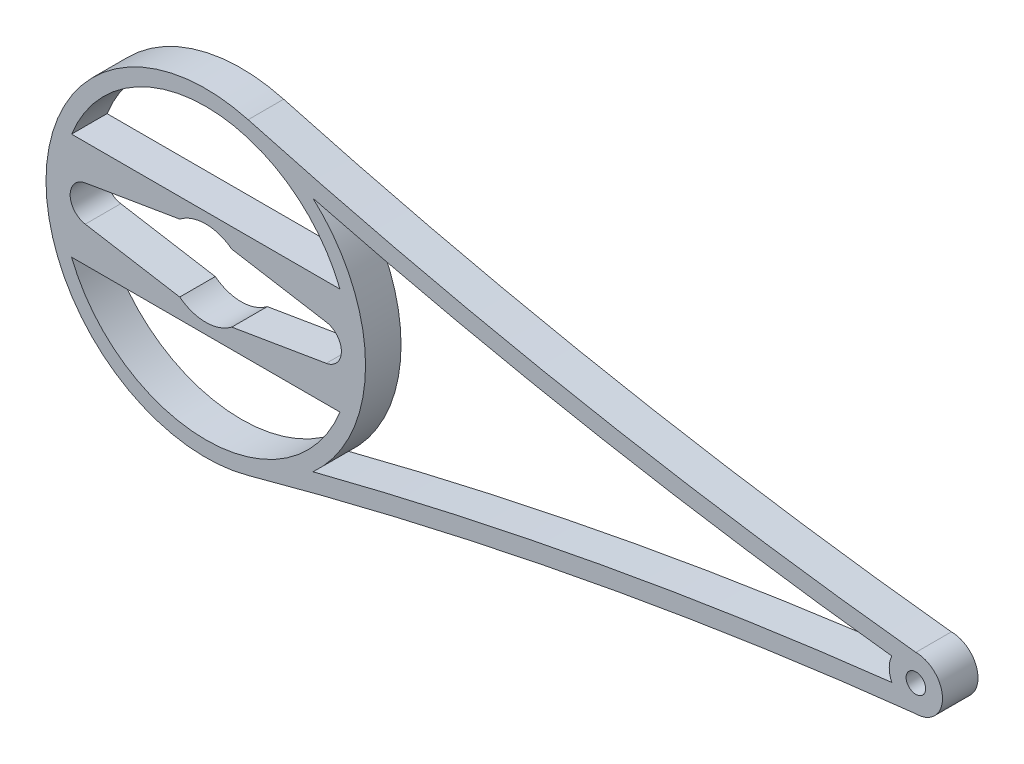
ISO-10303-21;
HEADER;
FILE_DESCRIPTION(('STEP AP214'),'2;1');
FILE_NAME('part.step','',(''),(''),'','','');
FILE_SCHEMA(('AUTOMOTIVE_DESIGN { 1 0 10303 214 1 1 1 1 }'));
ENDSEC;
DATA;
#1=APPLICATION_CONTEXT('core data for automotive mechanical design processes');
#2=APPLICATION_PROTOCOL_DEFINITION('international standard','automotive_design',2000,#1);
#3=PRODUCT_CONTEXT('',#1,'mechanical');
#4=PRODUCT('Part','Part','',(#3));
#5=PRODUCT_RELATED_PRODUCT_CATEGORY('part','',(#4));
#6=PRODUCT_DEFINITION_FORMATION('','',#4);
#7=PRODUCT_DEFINITION_CONTEXT('part definition',#1,'design');
#8=PRODUCT_DEFINITION('design','',#6,#7);
#9=PRODUCT_DEFINITION_SHAPE('','',#8);
#10=(LENGTH_UNIT() NAMED_UNIT(*) SI_UNIT(.MILLI.,.METRE.));
#11=(NAMED_UNIT(*) PLANE_ANGLE_UNIT() SI_UNIT($,.RADIAN.));
#12=(NAMED_UNIT(*) SI_UNIT($,.STERADIAN.) SOLID_ANGLE_UNIT());
#13=UNCERTAINTY_MEASURE_WITH_UNIT(LENGTH_MEASURE(1.E-05),#10,'distance_accuracy_value','');
#14=(GEOMETRIC_REPRESENTATION_CONTEXT(3) GLOBAL_UNCERTAINTY_ASSIGNED_CONTEXT((#13)) GLOBAL_UNIT_ASSIGNED_CONTEXT((#10,
#11,#12)) REPRESENTATION_CONTEXT('',''));
#15=CARTESIAN_POINT('',(0.,0.,0.));
#16=DIRECTION('',(0.,0.,1.));
#17=DIRECTION('',(1.,0.,0.));
#18=AXIS2_PLACEMENT_3D('',#15,#16,#17);
#19=CARTESIAN_POINT('',(132.546870891721,300.104276220759,2.5));
#20=DIRECTION('',(0.,0.,1.));
#21=DIRECTION('',(1.,0.,0.));
#22=AXIS2_PLACEMENT_3D('',#19,#20,#21);
#23=PLANE('',#22);
#24=CARTESIAN_POINT('',(100.,0.,2.5));
#25=DIRECTION('',(0.,0.,1.));
#26=DIRECTION('',(1.,0.,0.));
#27=AXIS2_PLACEMENT_3D('',#24,#25,#26);
#28=CIRCLE('',#27,1.375);
#29=CARTESIAN_POINT('',(101.375,0.,2.5));
#30=VERTEX_POINT('',#29);
#31=EDGE_CURVE('E557',#30,#30,#28,.T.);
#32=ORIENTED_EDGE('',*,*,#31,.F.);
#33=EDGE_LOOP('',(#32));
#34=FACE_BOUND('',#33,.T.);
#35=CARTESIAN_POINT('',(-16.55,0.,2.5));
#36=DIRECTION('',(0.,0.,1.));
#37=DIRECTION('',(1.,0.,0.));
#38=AXIS2_PLACEMENT_3D('',#35,#36,#37);
#39=CIRCLE('',#38,2.55);
#40=CARTESIAN_POINT('',(-16.9724253596674,2.51476774583854,2.5));
#41=VERTEX_POINT('',#40);
#42=CARTESIAN_POINT('',(-16.9724253596674,-2.51476774583853,2.5));
#43=VERTEX_POINT('',#42);
#44=EDGE_CURVE('E51',#41,#43,#39,.T.);
#45=ORIENTED_EDGE('',*,*,#44,.F.);
#46=DIRECTION('',(-0.986183429740603,-0.165657003791153,0.));
#47=VECTOR('',#46,1.);
#48=CARTESIAN_POINT('',(-16.9724253596674,2.51476774583854,2.5));
#49=LINE('',#48,#47);
#50=CARTESIAN_POINT('',(-3.6657195746538,4.75,2.5));
#51=VERTEX_POINT('',#50);
#52=EDGE_CURVE('E192',#51,#41,#49,.T.);
#53=ORIENTED_EDGE('',*,*,#52,.F.);
#54=CARTESIAN_POINT('',(0.,0.,2.5));
#55=DIRECTION('',(0.,0.,1.));
#56=DIRECTION('',(1.,0.,0.));
#57=AXIS2_PLACEMENT_3D('',#54,#55,#56);
#58=CIRCLE('',#57,6.);
#59=CARTESIAN_POINT('',(3.6657195746538,4.75,2.5));
#60=VERTEX_POINT('',#59);
#61=EDGE_CURVE('E195',#60,#51,#58,.T.);
#62=ORIENTED_EDGE('',*,*,#61,.F.);
#63=DIRECTION('',(-0.986183429740603,0.165657003791153,0.));
#64=VECTOR('',#63,1.);
#65=CARTESIAN_POINT('',(16.9724253596674,2.51476774583854,2.5));
#66=LINE('',#65,#64);
#67=CARTESIAN_POINT('',(16.9724253596674,2.51476774583854,2.5));
#68=VERTEX_POINT('',#67);
#69=EDGE_CURVE('E226',#68,#60,#66,.T.);
#70=ORIENTED_EDGE('',*,*,#69,.F.);
#71=CARTESIAN_POINT('',(16.55,0.,2.5));
#72=DIRECTION('',(0.,0.,1.));
#73=DIRECTION('',(-1.,0.,0.));
#74=AXIS2_PLACEMENT_3D('',#71,#72,#73);
#75=CIRCLE('',#74,2.55);
#76=CARTESIAN_POINT('',(16.9724253596674,-2.51476774583854,2.5));
#77=VERTEX_POINT('',#76);
#78=EDGE_CURVE('E223',#77,#68,#75,.T.);
#79=ORIENTED_EDGE('',*,*,#78,.F.);
#80=DIRECTION('',(0.986183429740603,0.165657003791153,0.));
#81=VECTOR('',#80,1.);
#82=CARTESIAN_POINT('',(16.9724253596674,-2.51476774583854,2.5));
#83=LINE('',#82,#81);
#84=CARTESIAN_POINT('',(3.66571957465379,-4.75,2.5));
#85=VERTEX_POINT('',#84);
#86=EDGE_CURVE('E220',#85,#77,#83,.T.);
#87=ORIENTED_EDGE('',*,*,#86,.F.);
#88=CARTESIAN_POINT('',(0.,0.,2.5));
#89=DIRECTION('',(0.,0.,1.));
#90=DIRECTION('',(1.,0.,0.));
#91=AXIS2_PLACEMENT_3D('',#88,#89,#90);
#92=CIRCLE('',#91,6.);
#93=CARTESIAN_POINT('',(-3.6657195746538,-4.75,2.5));
#94=VERTEX_POINT('',#93);
#95=EDGE_CURVE('E217',#94,#85,#92,.T.);
#96=ORIENTED_EDGE('',*,*,#95,.F.);
#97=DIRECTION('',(0.986183429740603,-0.165657003791154,0.));
#98=VECTOR('',#97,1.);
#99=CARTESIAN_POINT('',(-16.9724253596674,-2.51476774583854,2.5));
#100=LINE('',#99,#98);
#101=EDGE_CURVE('E215',#43,#94,#100,.T.);
#102=ORIENTED_EDGE('',*,*,#101,.F.);
#103=EDGE_LOOP('',(#45,#53,#62,#70,#79,#87,#96,#102));
#104=FACE_BOUND('',#103,.T.);
#105=CARTESIAN_POINT('',(165.093741783443,600.208552441517,2.5));
#106=DIRECTION('',(0.,0.,-1.));
#107=DIRECTION('',(1.,0.,0.));
#108=AXIS2_PLACEMENT_3D('',#105,#106,#107);
#109=CIRCLE('',#108,600.);
#110=CARTESIAN_POINT('',(100.,3.75,2.5));
#111=VERTEX_POINT('',#110);
#112=CARTESIAN_POINT('',(5.96724367891963,21.6942850280067,2.5));
#113=VERTEX_POINT('',#112);
#114=EDGE_CURVE('E310',#111,#113,#109,.T.);
#115=ORIENTED_EDGE('',*,*,#114,.T.);
#116=CARTESIAN_POINT('',(0.,0.,2.5));
#117=DIRECTION('',(0.,0.,1.));
#118=DIRECTION('',(1.,0.,0.));
#119=AXIS2_PLACEMENT_3D('',#116,#117,#118);
#120=CIRCLE('',#119,22.5);
#121=CARTESIAN_POINT('',(5.96724367891963,-21.6942850280067,2.5));
#122=VERTEX_POINT('',#121);
#123=EDGE_CURVE('E313',#113,#122,#120,.T.);
#124=ORIENTED_EDGE('',*,*,#123,.T.);
#125=CARTESIAN_POINT('',(165.093741783443,-600.208552441517,2.5));
#126=DIRECTION('',(0.,0.,-1.));
#127=DIRECTION('',(-1.,0.,0.));
#128=AXIS2_PLACEMENT_3D('',#125,#126,#127);
#129=CIRCLE('',#128,600.);
#130=CARTESIAN_POINT('',(100.,-3.75000000000014,2.5));
#131=VERTEX_POINT('',#130);
#132=EDGE_CURVE('E316',#122,#131,#129,.T.);
#133=ORIENTED_EDGE('',*,*,#132,.T.);
#134=CARTESIAN_POINT('',(100.,0.,2.5));
#135=DIRECTION('',(0.,0.,1.));
#136=DIRECTION('',(1.,0.,0.));
#137=AXIS2_PLACEMENT_3D('',#134,#135,#136);
#138=CIRCLE('',#137,3.75);
#139=EDGE_CURVE('E318',#131,#111,#138,.T.);
#140=ORIENTED_EDGE('',*,*,#139,.T.);
#141=EDGE_LOOP('',(#115,#124,#133,#140));
#142=FACE_BOUND('',#141,.T.);
#143=CARTESIAN_POINT('',(165.093741783443,600.208552441517,2.5));
#144=DIRECTION('',(0.,0.,-1.));
#145=DIRECTION('',(1.,0.,0.));
#146=AXIS2_PLACEMENT_3D('',#143,#144,#145);
#147=CIRCLE('',#146,602.5);
#148=CARTESIAN_POINT('',(96.6145446335033,1.61282111886629,2.5));
#149=VERTEX_POINT('',#148);
#150=CARTESIAN_POINT('',(15.1041910383297,16.6767326859201,2.5));
#151=VERTEX_POINT('',#150);
#152=EDGE_CURVE('E281',#149,#151,#147,.T.);
#153=ORIENTED_EDGE('',*,*,#152,.F.);
#154=CARTESIAN_POINT('',(100.,0.,2.5));
#155=DIRECTION('',(0.,0.,-1.));
#156=DIRECTION('',(1.,0.,0.));
#157=AXIS2_PLACEMENT_3D('',#154,#155,#156);
#158=CIRCLE('',#157,3.75000000000003);
#159=CARTESIAN_POINT('',(96.6145446335037,-1.61282111886629,2.5));
#160=VERTEX_POINT('',#159);
#161=EDGE_CURVE('E279',#160,#149,#158,.T.);
#162=ORIENTED_EDGE('',*,*,#161,.F.);
#163=CARTESIAN_POINT('',(165.093741783443,-600.208552441517,2.5));
#164=DIRECTION('',(0.,0.,-1.));
#165=DIRECTION('',(-1.,0.,0.));
#166=AXIS2_PLACEMENT_3D('',#163,#164,#165);
#167=CIRCLE('',#166,602.5);
#168=CARTESIAN_POINT('',(15.1041910383297,-16.6767326859201,2.5));
#169=VERTEX_POINT('',#168);
#170=EDGE_CURVE('E287',#169,#160,#167,.T.);
#171=ORIENTED_EDGE('',*,*,#170,.F.);
#172=CARTESIAN_POINT('',(0.,0.,2.5));
#173=DIRECTION('',(0.,0.,-1.));
#174=DIRECTION('',(1.,0.,0.));
#175=AXIS2_PLACEMENT_3D('',#172,#173,#174);
#176=CIRCLE('',#175,22.4999999999999);
#177=EDGE_CURVE('E284',#151,#169,#176,.T.);
#178=ORIENTED_EDGE('',*,*,#177,.F.);
#179=EDGE_LOOP('',(#153,#162,#171,#178));
#180=FACE_BOUND('',#179,.T.);
#181=DIRECTION('',(1.,0.,0.));
#182=VECTOR('',#181,1.);
#183=CARTESIAN_POINT('',(-18.9,7.5,2.5));
#184=LINE('',#183,#182);
#185=CARTESIAN_POINT('',(-18.9,7.50000000000001,2.5));
#186=VERTEX_POINT('',#185);
#187=CARTESIAN_POINT('',(18.9,7.5,2.5));
#188=VERTEX_POINT('',#187);
#189=EDGE_CURVE('E265',#186,#188,#184,.T.);
#190=ORIENTED_EDGE('',*,*,#189,.F.);
#191=CARTESIAN_POINT('',(0.,0.,2.5));
#192=DIRECTION('',(0.,0.,1.));
#193=DIRECTION('',(1.,0.,0.));
#194=AXIS2_PLACEMENT_3D('',#191,#192,#193);
#195=CIRCLE('',#194,20.3337158433967);
#196=EDGE_CURVE('E262',#188,#186,#195,.T.);
#197=ORIENTED_EDGE('',*,*,#196,.F.);
#198=EDGE_LOOP('',(#190,#197));
#199=FACE_BOUND('',#198,.T.);
#200=DIRECTION('',(-1.,0.,0.));
#201=VECTOR('',#200,1.);
#202=CARTESIAN_POINT('',(-18.9,-7.5,2.5));
#203=LINE('',#202,#201);
#204=CARTESIAN_POINT('',(18.9,-7.50000000000001,2.5));
#205=VERTEX_POINT('',#204);
#206=CARTESIAN_POINT('',(-18.9,-7.5,2.5));
#207=VERTEX_POINT('',#206);
#208=EDGE_CURVE('E248',#205,#207,#203,.T.);
#209=ORIENTED_EDGE('',*,*,#208,.F.);
#210=CARTESIAN_POINT('',(0.,0.,2.5));
#211=DIRECTION('',(0.,0.,1.));
#212=DIRECTION('',(1.,0.,0.));
#213=AXIS2_PLACEMENT_3D('',#210,#211,#212);
#214=CIRCLE('',#213,20.3337158433967);
#215=EDGE_CURVE('E245',#207,#205,#214,.T.);
#216=ORIENTED_EDGE('',*,*,#215,.F.);
#217=EDGE_LOOP('',(#209,#216));
#218=FACE_BOUND('',#217,.T.);
#219=ADVANCED_FACE('F36',(#34,#104,#142,#180,#199,#218),#23,.T.);
#220=CARTESIAN_POINT('',(132.546870891721,300.104276220759,-2.5));
#221=DIRECTION('',(0.,0.,1.));
#222=DIRECTION('',(1.,0.,0.));
#223=AXIS2_PLACEMENT_3D('',#220,#221,#222);
#224=PLANE('',#223);
#225=CARTESIAN_POINT('',(100.,0.,-2.5));
#226=DIRECTION('',(0.,0.,1.));
#227=DIRECTION('',(1.,0.,0.));
#228=AXIS2_PLACEMENT_3D('',#225,#226,#227);
#229=CIRCLE('',#228,1.375);
#230=CARTESIAN_POINT('',(101.375,0.,-2.5));
#231=VERTEX_POINT('',#230);
#232=EDGE_CURVE('E198',#231,#231,#229,.T.);
#233=ORIENTED_EDGE('',*,*,#232,.T.);
#234=EDGE_LOOP('',(#233));
#235=FACE_BOUND('',#234,.T.);
#236=DIRECTION('',(-0.986183429740603,-0.165657003791153,0.));
#237=VECTOR('',#236,1.);
#238=CARTESIAN_POINT('',(-16.9724253596674,2.51476774583854,-2.5));
#239=LINE('',#238,#237);
#240=CARTESIAN_POINT('',(-3.6657195746538,4.75,-2.5));
#241=VERTEX_POINT('',#240);
#242=CARTESIAN_POINT('',(-16.9724253596674,2.51476774583854,-2.5));
#243=VERTEX_POINT('',#242);
#244=EDGE_CURVE('E181',#241,#243,#239,.T.);
#245=ORIENTED_EDGE('',*,*,#244,.T.);
#246=CARTESIAN_POINT('',(-16.55,0.,-2.5));
#247=DIRECTION('',(0.,0.,1.));
#248=DIRECTION('',(1.,0.,0.));
#249=AXIS2_PLACEMENT_3D('',#246,#247,#248);
#250=CIRCLE('',#249,2.55);
#251=CARTESIAN_POINT('',(-16.9724253596674,-2.51476774583854,-2.5));
#252=VERTEX_POINT('',#251);
#253=EDGE_CURVE('E175',#243,#252,#250,.T.);
#254=ORIENTED_EDGE('',*,*,#253,.T.);
#255=DIRECTION('',(0.986183429740603,-0.165657003791154,0.));
#256=VECTOR('',#255,1.);
#257=CARTESIAN_POINT('',(-16.9724253596674,-2.51476774583854,-2.5));
#258=LINE('',#257,#256);
#259=CARTESIAN_POINT('',(-3.66571957465378,-4.75,-2.5));
#260=VERTEX_POINT('',#259);
#261=EDGE_CURVE('E184',#252,#260,#258,.T.);
#262=ORIENTED_EDGE('',*,*,#261,.T.);
#263=CARTESIAN_POINT('',(0.,0.,-2.5));
#264=DIRECTION('',(0.,0.,1.));
#265=DIRECTION('',(1.,0.,0.));
#266=AXIS2_PLACEMENT_3D('',#263,#264,#265);
#267=CIRCLE('',#266,6.);
#268=CARTESIAN_POINT('',(3.66571957465379,-4.75,-2.5));
#269=VERTEX_POINT('',#268);
#270=EDGE_CURVE('E59',#260,#269,#267,.T.);
#271=ORIENTED_EDGE('',*,*,#270,.T.);
#272=DIRECTION('',(0.986183429740603,0.165657003791153,0.));
#273=VECTOR('',#272,1.);
#274=CARTESIAN_POINT('',(16.9724253596674,-2.51476774583854,-2.5));
#275=LINE('',#274,#273);
#276=CARTESIAN_POINT('',(16.9724253596674,-2.51476774583854,-2.5));
#277=VERTEX_POINT('',#276);
#278=EDGE_CURVE('E202',#269,#277,#275,.T.);
#279=ORIENTED_EDGE('',*,*,#278,.T.);
#280=CARTESIAN_POINT('',(16.55,0.,-2.5));
#281=DIRECTION('',(0.,0.,1.));
#282=DIRECTION('',(-1.,0.,0.));
#283=AXIS2_PLACEMENT_3D('',#280,#281,#282);
#284=CIRCLE('',#283,2.55);
#285=CARTESIAN_POINT('',(16.9724253596674,2.51476774583854,-2.5));
#286=VERTEX_POINT('',#285);
#287=EDGE_CURVE('E205',#277,#286,#284,.T.);
#288=ORIENTED_EDGE('',*,*,#287,.T.);
#289=DIRECTION('',(-0.986183429740603,0.165657003791153,0.));
#290=VECTOR('',#289,1.);
#291=CARTESIAN_POINT('',(16.9724253596674,2.51476774583854,-2.5));
#292=LINE('',#291,#290);
#293=CARTESIAN_POINT('',(3.6657195746538,4.75,-2.5));
#294=VERTEX_POINT('',#293);
#295=EDGE_CURVE('E208',#286,#294,#292,.T.);
#296=ORIENTED_EDGE('',*,*,#295,.T.);
#297=CARTESIAN_POINT('',(0.,0.,-2.5));
#298=DIRECTION('',(0.,0.,1.));
#299=DIRECTION('',(1.,0.,0.));
#300=AXIS2_PLACEMENT_3D('',#297,#298,#299);
#301=CIRCLE('',#300,6.);
#302=EDGE_CURVE('E211',#294,#241,#301,.T.);
#303=ORIENTED_EDGE('',*,*,#302,.T.);
#304=EDGE_LOOP('',(#245,#254,#262,#271,#279,#288,#296,#303));
#305=FACE_BOUND('',#304,.T.);
#306=CARTESIAN_POINT('',(0.,0.,-2.5));
#307=DIRECTION('',(0.,0.,1.));
#308=DIRECTION('',(1.,0.,0.));
#309=AXIS2_PLACEMENT_3D('',#306,#307,#308);
#310=CIRCLE('',#309,20.3337158433967);
#311=CARTESIAN_POINT('',(18.9,7.50000000000001,-2.5));
#312=VERTEX_POINT('',#311);
#313=CARTESIAN_POINT('',(-18.9,7.5,-2.5));
#314=VERTEX_POINT('',#313);
#315=EDGE_CURVE('E261',#312,#314,#310,.T.);
#316=ORIENTED_EDGE('',*,*,#315,.T.);
#317=DIRECTION('',(1.,0.,0.));
#318=VECTOR('',#317,1.);
#319=CARTESIAN_POINT('',(-18.9,7.5,-2.5));
#320=LINE('',#319,#318);
#321=EDGE_CURVE('E266',#314,#312,#320,.T.);
#322=ORIENTED_EDGE('',*,*,#321,.T.);
#323=EDGE_LOOP('',(#316,#322));
#324=FACE_BOUND('',#323,.T.);
#325=CARTESIAN_POINT('',(165.093741783443,600.208552441517,-2.5));
#326=DIRECTION('',(0.,0.,-1.));
#327=DIRECTION('',(1.,0.,0.));
#328=AXIS2_PLACEMENT_3D('',#325,#326,#327);
#329=CIRCLE('',#328,600.);
#330=CARTESIAN_POINT('',(100.,3.75,-2.5));
#331=VERTEX_POINT('',#330);
#332=CARTESIAN_POINT('',(5.96724367891963,21.6942850280067,-2.5));
#333=VERTEX_POINT('',#332);
#334=EDGE_CURVE('E309',#331,#333,#329,.T.);
#335=ORIENTED_EDGE('',*,*,#334,.F.);
#336=CARTESIAN_POINT('',(100.,0.,-2.5));
#337=DIRECTION('',(0.,0.,1.));
#338=DIRECTION('',(1.,0.,0.));
#339=AXIS2_PLACEMENT_3D('',#336,#337,#338);
#340=CIRCLE('',#339,3.75);
#341=CARTESIAN_POINT('',(100.,-3.75000000000014,-2.5));
#342=VERTEX_POINT('',#341);
#343=EDGE_CURVE('E314',#342,#331,#340,.T.);
#344=ORIENTED_EDGE('',*,*,#343,.F.);
#345=CARTESIAN_POINT('',(165.093741783443,-600.208552441517,-2.5));
#346=DIRECTION('',(0.,0.,-1.));
#347=DIRECTION('',(-1.,0.,0.));
#348=AXIS2_PLACEMENT_3D('',#345,#346,#347);
#349=CIRCLE('',#348,600.);
#350=CARTESIAN_POINT('',(5.96724367891963,-21.6942850280067,-2.5));
#351=VERTEX_POINT('',#350);
#352=EDGE_CURVE('E325',#351,#342,#349,.T.);
#353=ORIENTED_EDGE('',*,*,#352,.F.);
#354=CARTESIAN_POINT('',(0.,0.,-2.5));
#355=DIRECTION('',(0.,0.,1.));
#356=DIRECTION('',(1.,0.,0.));
#357=AXIS2_PLACEMENT_3D('',#354,#355,#356);
#358=CIRCLE('',#357,22.5);
#359=EDGE_CURVE('E323',#333,#351,#358,.T.);
#360=ORIENTED_EDGE('',*,*,#359,.F.);
#361=EDGE_LOOP('',(#335,#344,#353,#360));
#362=FACE_BOUND('',#361,.T.);
#363=CARTESIAN_POINT('',(100.,0.,-2.5));
#364=DIRECTION('',(0.,0.,-1.));
#365=DIRECTION('',(1.,0.,0.));
#366=AXIS2_PLACEMENT_3D('',#363,#364,#365);
#367=CIRCLE('',#366,3.75000000000003);
#368=CARTESIAN_POINT('',(96.6145446335037,-1.61282111886629,-2.5));
#369=VERTEX_POINT('',#368);
#370=CARTESIAN_POINT('',(96.6145446335033,1.61282111886629,-2.5));
#371=VERTEX_POINT('',#370);
#372=EDGE_CURVE('E278',#369,#371,#367,.T.);
#373=ORIENTED_EDGE('',*,*,#372,.T.);
#374=CARTESIAN_POINT('',(165.093741783443,600.208552441517,-2.5));
#375=DIRECTION('',(0.,0.,-1.));
#376=DIRECTION('',(1.,0.,0.));
#377=AXIS2_PLACEMENT_3D('',#374,#375,#376);
#378=CIRCLE('',#377,602.5);
#379=CARTESIAN_POINT('',(15.1041910383297,16.6767326859201,-2.5));
#380=VERTEX_POINT('',#379);
#381=EDGE_CURVE('E292',#371,#380,#378,.T.);
#382=ORIENTED_EDGE('',*,*,#381,.T.);
#383=CARTESIAN_POINT('',(0.,0.,-2.5));
#384=DIRECTION('',(0.,0.,-1.));
#385=DIRECTION('',(1.,0.,0.));
#386=AXIS2_PLACEMENT_3D('',#383,#384,#385);
#387=CIRCLE('',#386,22.4999999999999);
#388=CARTESIAN_POINT('',(15.1041910383298,-16.6767326859201,-2.5));
#389=VERTEX_POINT('',#388);
#390=EDGE_CURVE('E295',#380,#389,#387,.T.);
#391=ORIENTED_EDGE('',*,*,#390,.T.);
#392=CARTESIAN_POINT('',(165.093741783443,-600.208552441517,-2.5));
#393=DIRECTION('',(0.,0.,-1.));
#394=DIRECTION('',(-1.,0.,0.));
#395=AXIS2_PLACEMENT_3D('',#392,#393,#394);
#396=CIRCLE('',#395,602.5);
#397=EDGE_CURVE('E282',#389,#369,#396,.T.);
#398=ORIENTED_EDGE('',*,*,#397,.T.);
#399=EDGE_LOOP('',(#373,#382,#391,#398));
#400=FACE_BOUND('',#399,.T.);
#401=CARTESIAN_POINT('',(0.,0.,-2.5));
#402=DIRECTION('',(0.,0.,1.));
#403=DIRECTION('',(1.,0.,0.));
#404=AXIS2_PLACEMENT_3D('',#401,#402,#403);
#405=CIRCLE('',#404,20.3337158433967);
#406=CARTESIAN_POINT('',(-18.9,-7.50000000000001,-2.5));
#407=VERTEX_POINT('',#406);
#408=CARTESIAN_POINT('',(18.9,-7.5,-2.5));
#409=VERTEX_POINT('',#408);
#410=EDGE_CURVE('E233',#407,#409,#405,.T.);
#411=ORIENTED_EDGE('',*,*,#410,.T.);
#412=DIRECTION('',(-1.,0.,0.));
#413=VECTOR('',#412,1.);
#414=CARTESIAN_POINT('',(-18.9,-7.5,-2.5));
#415=LINE('',#414,#413);
#416=EDGE_CURVE('E249',#409,#407,#415,.T.);
#417=ORIENTED_EDGE('',*,*,#416,.T.);
#418=EDGE_LOOP('',(#411,#417));
#419=FACE_BOUND('',#418,.T.);
#420=ADVANCED_FACE('F188',(#235,#305,#324,#362,#400,#419),#224,.F.);
#421=CARTESIAN_POINT('',(165.093741783443,600.208552441517,2.5));
#422=DIRECTION('',(0.,0.,-1.));
#423=DIRECTION('',(-1.,0.,0.));
#424=AXIS2_PLACEMENT_3D('',#421,#422,#423);
#425=CYLINDRICAL_SURFACE('',#424,600.);
#426=ORIENTED_EDGE('',*,*,#334,.T.);
#427=DIRECTION('',(0.,0.,-1.));
#428=VECTOR('',#427,1.);
#429=CARTESIAN_POINT('',(5.96724367891963,21.6942850280067,2.5));
#430=LINE('',#429,#428);
#431=EDGE_CURVE('E11',#113,#333,#430,.T.);
#432=ORIENTED_EDGE('',*,*,#431,.F.);
#433=ORIENTED_EDGE('',*,*,#114,.F.);
#434=DIRECTION('',(0.,0.,-1.));
#435=VECTOR('',#434,1.);
#436=CARTESIAN_POINT('',(100.,3.75,2.5));
#437=LINE('',#436,#435);
#438=EDGE_CURVE('E320',#111,#331,#437,.T.);
#439=ORIENTED_EDGE('',*,*,#438,.T.);
#440=EDGE_LOOP('',(#426,#432,#433,#439));
#441=FACE_BOUND('',#440,.T.);
#442=ADVANCED_FACE('F38',(#441),#425,.F.);
#443=CARTESIAN_POINT('',(0.,0.,2.5));
#444=DIRECTION('',(0.,0.,-1.));
#445=DIRECTION('',(-1.,0.,0.));
#446=AXIS2_PLACEMENT_3D('',#443,#444,#445);
#447=CYLINDRICAL_SURFACE('',#446,22.5);
#448=ORIENTED_EDGE('',*,*,#359,.T.);
#449=DIRECTION('',(0.,0.,-1.));
#450=VECTOR('',#449,1.);
#451=CARTESIAN_POINT('',(5.96724367891963,-21.6942850280067,2.5));
#452=LINE('',#451,#450);
#453=EDGE_CURVE('E44',#122,#351,#452,.T.);
#454=ORIENTED_EDGE('',*,*,#453,.F.);
#455=ORIENTED_EDGE('',*,*,#123,.F.);
#456=ORIENTED_EDGE('',*,*,#431,.T.);
#457=EDGE_LOOP('',(#448,#454,#455,#456));
#458=FACE_BOUND('',#457,.T.);
#459=ADVANCED_FACE('F353',(#458),#447,.T.);
#460=CARTESIAN_POINT('',(165.093741783443,-600.208552441517,2.5));
#461=DIRECTION('',(0.,0.,-1.));
#462=DIRECTION('',(-1.,0.,0.));
#463=AXIS2_PLACEMENT_3D('',#460,#461,#462);
#464=CYLINDRICAL_SURFACE('',#463,600.);
#465=ORIENTED_EDGE('',*,*,#352,.T.);
#466=DIRECTION('',(0.,0.,-1.));
#467=VECTOR('',#466,1.);
#468=CARTESIAN_POINT('',(100.,-3.75000000000014,2.5));
#469=LINE('',#468,#467);
#470=EDGE_CURVE('E330',#131,#342,#469,.T.);
#471=ORIENTED_EDGE('',*,*,#470,.F.);
#472=ORIENTED_EDGE('',*,*,#132,.F.);
#473=ORIENTED_EDGE('',*,*,#453,.T.);
#474=EDGE_LOOP('',(#465,#471,#472,#473));
#475=FACE_BOUND('',#474,.T.);
#476=ADVANCED_FACE('F337',(#475),#464,.F.);
#477=CARTESIAN_POINT('',(100.,0.,2.5));
#478=DIRECTION('',(0.,0.,-1.));
#479=DIRECTION('',(-1.,0.,0.));
#480=AXIS2_PLACEMENT_3D('',#477,#478,#479);
#481=CYLINDRICAL_SURFACE('',#480,3.75);
#482=ORIENTED_EDGE('',*,*,#343,.T.);
#483=ORIENTED_EDGE('',*,*,#438,.F.);
#484=ORIENTED_EDGE('',*,*,#139,.F.);
#485=ORIENTED_EDGE('',*,*,#470,.T.);
#486=EDGE_LOOP('',(#482,#483,#484,#485));
#487=FACE_BOUND('',#486,.T.);
#488=ADVANCED_FACE('F346',(#487),#481,.T.);
#489=CARTESIAN_POINT('',(100.,0.,2.5));
#490=DIRECTION('',(0.,0.,-1.));
#491=DIRECTION('',(-1.,0.,0.));
#492=AXIS2_PLACEMENT_3D('',#489,#490,#491);
#493=CYLINDRICAL_SURFACE('',#492,3.75000000000003);
#494=ORIENTED_EDGE('',*,*,#372,.F.);
#495=DIRECTION('',(0.,0.,-1.));
#496=VECTOR('',#495,1.);
#497=CARTESIAN_POINT('',(96.6145446335037,-1.61282111886629,2.5));
#498=LINE('',#497,#496);
#499=EDGE_CURVE('E289',#160,#369,#498,.T.);
#500=ORIENTED_EDGE('',*,*,#499,.F.);
#501=ORIENTED_EDGE('',*,*,#161,.T.);
#502=DIRECTION('',(0.,0.,-1.));
#503=VECTOR('',#502,1.);
#504=CARTESIAN_POINT('',(96.6145446335033,1.61282111886629,2.5));
#505=LINE('',#504,#503);
#506=EDGE_CURVE('E306',#149,#371,#505,.T.);
#507=ORIENTED_EDGE('',*,*,#506,.T.);
#508=EDGE_LOOP('',(#494,#500,#501,#507));
#509=FACE_BOUND('',#508,.T.);
#510=ADVANCED_FACE('F371',(#509),#493,.T.);
#511=CARTESIAN_POINT('',(165.093741783443,600.208552441517,2.5));
#512=DIRECTION('',(0.,0.,-1.));
#513=DIRECTION('',(-1.,0.,0.));
#514=AXIS2_PLACEMENT_3D('',#511,#512,#513);
#515=CYLINDRICAL_SURFACE('',#514,602.5);
#516=ORIENTED_EDGE('',*,*,#381,.F.);
#517=ORIENTED_EDGE('',*,*,#506,.F.);
#518=ORIENTED_EDGE('',*,*,#152,.T.);
#519=DIRECTION('',(0.,0.,-1.));
#520=VECTOR('',#519,1.);
#521=CARTESIAN_POINT('',(15.1041910383297,16.6767326859201,2.5));
#522=LINE('',#521,#520);
#523=EDGE_CURVE('E304',#151,#380,#522,.T.);
#524=ORIENTED_EDGE('',*,*,#523,.T.);
#525=EDGE_LOOP('',(#516,#517,#518,#524));
#526=FACE_BOUND('',#525,.T.);
#527=ADVANCED_FACE('F378',(#526),#515,.T.);
#528=CARTESIAN_POINT('',(0.,0.,2.5));
#529=DIRECTION('',(0.,0.,-1.));
#530=DIRECTION('',(-1.,0.,0.));
#531=AXIS2_PLACEMENT_3D('',#528,#529,#530);
#532=CYLINDRICAL_SURFACE('',#531,22.4999999999999);
#533=ORIENTED_EDGE('',*,*,#390,.F.);
#534=ORIENTED_EDGE('',*,*,#523,.F.);
#535=ORIENTED_EDGE('',*,*,#177,.T.);
#536=DIRECTION('',(0.,0.,-1.));
#537=VECTOR('',#536,1.);
#538=CARTESIAN_POINT('',(15.1041910383298,-16.6767326859201,2.5));
#539=LINE('',#538,#537);
#540=EDGE_CURVE('E302',#169,#389,#539,.T.);
#541=ORIENTED_EDGE('',*,*,#540,.T.);
#542=EDGE_LOOP('',(#533,#534,#535,#541));
#543=FACE_BOUND('',#542,.T.);
#544=ADVANCED_FACE('F383',(#543),#532,.T.);
#545=CARTESIAN_POINT('',(165.093741783443,-600.208552441517,2.5));
#546=DIRECTION('',(0.,0.,-1.));
#547=DIRECTION('',(-1.,0.,0.));
#548=AXIS2_PLACEMENT_3D('',#545,#546,#547);
#549=CYLINDRICAL_SURFACE('',#548,602.5);
#550=ORIENTED_EDGE('',*,*,#397,.F.);
#551=ORIENTED_EDGE('',*,*,#540,.F.);
#552=ORIENTED_EDGE('',*,*,#170,.T.);
#553=ORIENTED_EDGE('',*,*,#499,.T.);
#554=EDGE_LOOP('',(#550,#551,#552,#553));
#555=FACE_BOUND('',#554,.T.);
#556=ADVANCED_FACE('F390',(#555),#549,.T.);
#557=CARTESIAN_POINT('',(0.,0.,2.5));
#558=DIRECTION('',(0.,0.,-1.));
#559=DIRECTION('',(-1.,0.,0.));
#560=AXIS2_PLACEMENT_3D('',#557,#558,#559);
#561=CYLINDRICAL_SURFACE('',#560,20.3337158433967);
#562=ORIENTED_EDGE('',*,*,#315,.F.);
#563=DIRECTION('',(0.,0.,-1.));
#564=VECTOR('',#563,1.);
#565=CARTESIAN_POINT('',(18.9,7.5,2.5));
#566=LINE('',#565,#564);
#567=EDGE_CURVE('E268',#188,#312,#566,.T.);
#568=ORIENTED_EDGE('',*,*,#567,.F.);
#569=ORIENTED_EDGE('',*,*,#196,.T.);
#570=DIRECTION('',(0.,0.,-1.));
#571=VECTOR('',#570,1.);
#572=CARTESIAN_POINT('',(-18.9,7.5,2.5));
#573=LINE('',#572,#571);
#574=EDGE_CURVE('E275',#186,#314,#573,.T.);
#575=ORIENTED_EDGE('',*,*,#574,.T.);
#576=EDGE_LOOP('',(#562,#568,#569,#575));
#577=FACE_BOUND('',#576,.T.);
#578=ADVANCED_FACE('F417',(#577),#561,.F.);
#579=CARTESIAN_POINT('',(-18.9,7.5,2.5));
#580=DIRECTION('',(0.,1.,0.));
#581=DIRECTION('',(0.,0.,1.));
#582=AXIS2_PLACEMENT_3D('',#579,#580,#581);
#583=PLANE('',#582);
#584=ORIENTED_EDGE('',*,*,#321,.F.);
#585=ORIENTED_EDGE('',*,*,#574,.F.);
#586=ORIENTED_EDGE('',*,*,#189,.T.);
#587=ORIENTED_EDGE('',*,*,#567,.T.);
#588=EDGE_LOOP('',(#584,#585,#586,#587));
#589=FACE_BOUND('',#588,.T.);
#590=ADVANCED_FACE('F410',(#589),#583,.T.);
#591=CARTESIAN_POINT('',(0.,0.,2.5));
#592=DIRECTION('',(0.,0.,-1.));
#593=DIRECTION('',(-1.,0.,0.));
#594=AXIS2_PLACEMENT_3D('',#591,#592,#593);
#595=CYLINDRICAL_SURFACE('',#594,20.3337158433967);
#596=ORIENTED_EDGE('',*,*,#410,.F.);
#597=DIRECTION('',(0.,0.,-1.));
#598=VECTOR('',#597,1.);
#599=CARTESIAN_POINT('',(-18.9,-7.5,2.5));
#600=LINE('',#599,#598);
#601=EDGE_CURVE('E251',#207,#407,#600,.T.);
#602=ORIENTED_EDGE('',*,*,#601,.F.);
#603=ORIENTED_EDGE('',*,*,#215,.T.);
#604=DIRECTION('',(0.,0.,-1.));
#605=VECTOR('',#604,1.);
#606=CARTESIAN_POINT('',(18.9,-7.5,2.5));
#607=LINE('',#606,#605);
#608=EDGE_CURVE('E258',#205,#409,#607,.T.);
#609=ORIENTED_EDGE('',*,*,#608,.T.);
#610=EDGE_LOOP('',(#596,#602,#603,#609));
#611=FACE_BOUND('',#610,.T.);
#612=ADVANCED_FACE('F408',(#611),#595,.F.);
#613=CARTESIAN_POINT('',(-18.9,-7.5,2.5));
#614=DIRECTION('',(0.,-1.,0.));
#615=DIRECTION('',(0.,0.,-1.));
#616=AXIS2_PLACEMENT_3D('',#613,#614,#615);
#617=PLANE('',#616);
#618=ORIENTED_EDGE('',*,*,#416,.F.);
#619=ORIENTED_EDGE('',*,*,#608,.F.);
#620=ORIENTED_EDGE('',*,*,#208,.T.);
#621=ORIENTED_EDGE('',*,*,#601,.T.);
#622=EDGE_LOOP('',(#618,#619,#620,#621));
#623=FACE_BOUND('',#622,.T.);
#624=ADVANCED_FACE('F406',(#623),#617,.T.);
#625=CARTESIAN_POINT('',(-16.55,0.,-2.5));
#626=DIRECTION('',(0.,0.,1.));
#627=DIRECTION('',(1.,0.,0.));
#628=AXIS2_PLACEMENT_3D('',#625,#626,#627);
#629=CYLINDRICAL_SURFACE('',#628,2.55);
#630=ORIENTED_EDGE('',*,*,#44,.T.);
#631=DIRECTION('',(0.,0.,1.));
#632=VECTOR('',#631,1.);
#633=CARTESIAN_POINT('',(-16.9724253596674,-2.51476774583854,-2.5));
#634=LINE('',#633,#632);
#635=EDGE_CURVE('E171',#252,#43,#634,.T.);
#636=ORIENTED_EDGE('',*,*,#635,.F.);
#637=ORIENTED_EDGE('',*,*,#253,.F.);
#638=DIRECTION('',(0.,0.,1.));
#639=VECTOR('',#638,1.);
#640=CARTESIAN_POINT('',(-16.9724253596674,2.51476774583854,-2.5));
#641=LINE('',#640,#639);
#642=EDGE_CURVE('E231',#243,#41,#641,.T.);
#643=ORIENTED_EDGE('',*,*,#642,.T.);
#644=EDGE_LOOP('',(#630,#636,#637,#643));
#645=FACE_BOUND('',#644,.T.);
#646=ADVANCED_FACE('F173',(#645),#629,.F.);
#647=CARTESIAN_POINT('',(-16.9724253596674,2.51476774583854,-2.5));
#648=DIRECTION('',(-0.165657003791153,0.986183429740603,0.));
#649=DIRECTION('',(-0.986183429740603,-0.165657003791153,0.));
#650=AXIS2_PLACEMENT_3D('',#647,#648,#649);
#651=PLANE('',#650);
#652=ORIENTED_EDGE('',*,*,#52,.T.);
#653=ORIENTED_EDGE('',*,*,#642,.F.);
#654=ORIENTED_EDGE('',*,*,#244,.F.);
#655=DIRECTION('',(0.,0.,1.));
#656=VECTOR('',#655,1.);
#657=CARTESIAN_POINT('',(-3.6657195746538,4.75,-2.5));
#658=LINE('',#657,#656);
#659=EDGE_CURVE('E234',#241,#51,#658,.T.);
#660=ORIENTED_EDGE('',*,*,#659,.T.);
#661=EDGE_LOOP('',(#652,#653,#654,#660));
#662=FACE_BOUND('',#661,.T.);
#663=ADVANCED_FACE('F463',(#662),#651,.F.);
#664=CARTESIAN_POINT('',(0.,0.,-2.5));
#665=DIRECTION('',(0.,0.,1.));
#666=DIRECTION('',(1.,0.,0.));
#667=AXIS2_PLACEMENT_3D('',#664,#665,#666);
#668=CYLINDRICAL_SURFACE('',#667,6.);
#669=ORIENTED_EDGE('',*,*,#61,.T.);
#670=ORIENTED_EDGE('',*,*,#659,.F.);
#671=ORIENTED_EDGE('',*,*,#302,.F.);
#672=DIRECTION('',(0.,0.,1.));
#673=VECTOR('',#672,1.);
#674=CARTESIAN_POINT('',(3.6657195746538,4.75,-2.5));
#675=LINE('',#674,#673);
#676=EDGE_CURVE('E236',#294,#60,#675,.T.);
#677=ORIENTED_EDGE('',*,*,#676,.T.);
#678=EDGE_LOOP('',(#669,#670,#671,#677));
#679=FACE_BOUND('',#678,.T.);
#680=ADVANCED_FACE('F471',(#679),#668,.F.);
#681=CARTESIAN_POINT('',(16.9724253596674,2.51476774583854,-2.5));
#682=DIRECTION('',(0.165657003791153,0.986183429740603,0.));
#683=DIRECTION('',(-0.986183429740603,0.165657003791153,0.));
#684=AXIS2_PLACEMENT_3D('',#681,#682,#683);
#685=PLANE('',#684);
#686=ORIENTED_EDGE('',*,*,#69,.T.);
#687=ORIENTED_EDGE('',*,*,#676,.F.);
#688=ORIENTED_EDGE('',*,*,#295,.F.);
#689=DIRECTION('',(0.,0.,1.));
#690=VECTOR('',#689,1.);
#691=CARTESIAN_POINT('',(16.9724253596674,2.51476774583854,-2.5));
#692=LINE('',#691,#690);
#693=EDGE_CURVE('E238',#286,#68,#692,.T.);
#694=ORIENTED_EDGE('',*,*,#693,.T.);
#695=EDGE_LOOP('',(#686,#687,#688,#694));
#696=FACE_BOUND('',#695,.T.);
#697=ADVANCED_FACE('F481',(#696),#685,.F.);
#698=CARTESIAN_POINT('',(16.55,0.,-2.5));
#699=DIRECTION('',(0.,0.,1.));
#700=DIRECTION('',(1.,0.,0.));
#701=AXIS2_PLACEMENT_3D('',#698,#699,#700);
#702=CYLINDRICAL_SURFACE('',#701,2.55);
#703=ORIENTED_EDGE('',*,*,#78,.T.);
#704=ORIENTED_EDGE('',*,*,#693,.F.);
#705=ORIENTED_EDGE('',*,*,#287,.F.);
#706=DIRECTION('',(0.,0.,1.));
#707=VECTOR('',#706,1.);
#708=CARTESIAN_POINT('',(16.9724253596674,-2.51476774583854,-2.5));
#709=LINE('',#708,#707);
#710=EDGE_CURVE('E240',#277,#77,#709,.T.);
#711=ORIENTED_EDGE('',*,*,#710,.T.);
#712=EDGE_LOOP('',(#703,#704,#705,#711));
#713=FACE_BOUND('',#712,.T.);
#714=ADVANCED_FACE('F491',(#713),#702,.F.);
#715=CARTESIAN_POINT('',(16.9724253596674,-2.51476774583854,-2.5));
#716=DIRECTION('',(0.165657003791153,-0.986183429740603,0.));
#717=DIRECTION('',(0.986183429740603,0.165657003791153,0.));
#718=AXIS2_PLACEMENT_3D('',#715,#716,#717);
#719=PLANE('',#718);
#720=ORIENTED_EDGE('',*,*,#86,.T.);
#721=ORIENTED_EDGE('',*,*,#710,.F.);
#722=ORIENTED_EDGE('',*,*,#278,.F.);
#723=DIRECTION('',(0.,0.,1.));
#724=VECTOR('',#723,1.);
#725=CARTESIAN_POINT('',(3.66571957465379,-4.75,-2.5));
#726=LINE('',#725,#724);
#727=EDGE_CURVE('E242',#269,#85,#726,.T.);
#728=ORIENTED_EDGE('',*,*,#727,.T.);
#729=EDGE_LOOP('',(#720,#721,#722,#728));
#730=FACE_BOUND('',#729,.T.);
#731=ADVANCED_FACE('F501',(#730),#719,.F.);
#732=CARTESIAN_POINT('',(0.,0.,-2.5));
#733=DIRECTION('',(0.,0.,1.));
#734=DIRECTION('',(1.,0.,0.));
#735=AXIS2_PLACEMENT_3D('',#732,#733,#734);
#736=CYLINDRICAL_SURFACE('',#735,6.);
#737=ORIENTED_EDGE('',*,*,#95,.T.);
#738=ORIENTED_EDGE('',*,*,#727,.F.);
#739=ORIENTED_EDGE('',*,*,#270,.F.);
#740=DIRECTION('',(0.,0.,1.));
#741=VECTOR('',#740,1.);
#742=CARTESIAN_POINT('',(-3.6657195746538,-4.75,-2.5));
#743=LINE('',#742,#741);
#744=EDGE_CURVE('E180',#260,#94,#743,.T.);
#745=ORIENTED_EDGE('',*,*,#744,.T.);
#746=EDGE_LOOP('',(#737,#738,#739,#745));
#747=FACE_BOUND('',#746,.T.);
#748=ADVANCED_FACE('F511',(#747),#736,.F.);
#749=CARTESIAN_POINT('',(-16.9724253596674,-2.51476774583854,-2.5));
#750=DIRECTION('',(-0.165657003791153,-0.986183429740603,0.));
#751=DIRECTION('',(0.986183429740603,-0.165657003791153,0.));
#752=AXIS2_PLACEMENT_3D('',#749,#750,#751);
#753=PLANE('',#752);
#754=ORIENTED_EDGE('',*,*,#101,.T.);
#755=ORIENTED_EDGE('',*,*,#744,.F.);
#756=ORIENTED_EDGE('',*,*,#261,.F.);
#757=ORIENTED_EDGE('',*,*,#635,.T.);
#758=EDGE_LOOP('',(#754,#755,#756,#757));
#759=FACE_BOUND('',#758,.T.);
#760=ADVANCED_FACE('F185',(#759),#753,.F.);
#761=CARTESIAN_POINT('',(100.,0.,-2.5));
#762=DIRECTION('',(0.,0.,1.));
#763=DIRECTION('',(1.,0.,0.));
#764=AXIS2_PLACEMENT_3D('',#761,#762,#763);
#765=CYLINDRICAL_SURFACE('',#764,1.375);
#766=ORIENTED_EDGE('',*,*,#232,.F.);
#767=EDGE_LOOP('',(#766));
#768=FACE_BOUND('',#767,.T.);
#769=ORIENTED_EDGE('',*,*,#31,.T.);
#770=EDGE_LOOP('',(#769));
#771=FACE_BOUND('',#770,.T.);
#772=ADVANCED_FACE('F528',(#768,#771),#765,.F.);
#773=CLOSED_SHELL('',(#219,#420,#442,#459,#476,#488,#510,#527,#544,#556,#578,#590,#612,#624,
#646,#663,#680,#697,#714,#731,#748,#760,#772));
#774=MANIFOLD_SOLID_BREP('B2',#773);
#775=ADVANCED_BREP_SHAPE_REPRESENTATION('',(#18,#774),#14);
#776=SHAPE_DEFINITION_REPRESENTATION(#9,#775);
ENDSEC;
END-ISO-10303-21;
